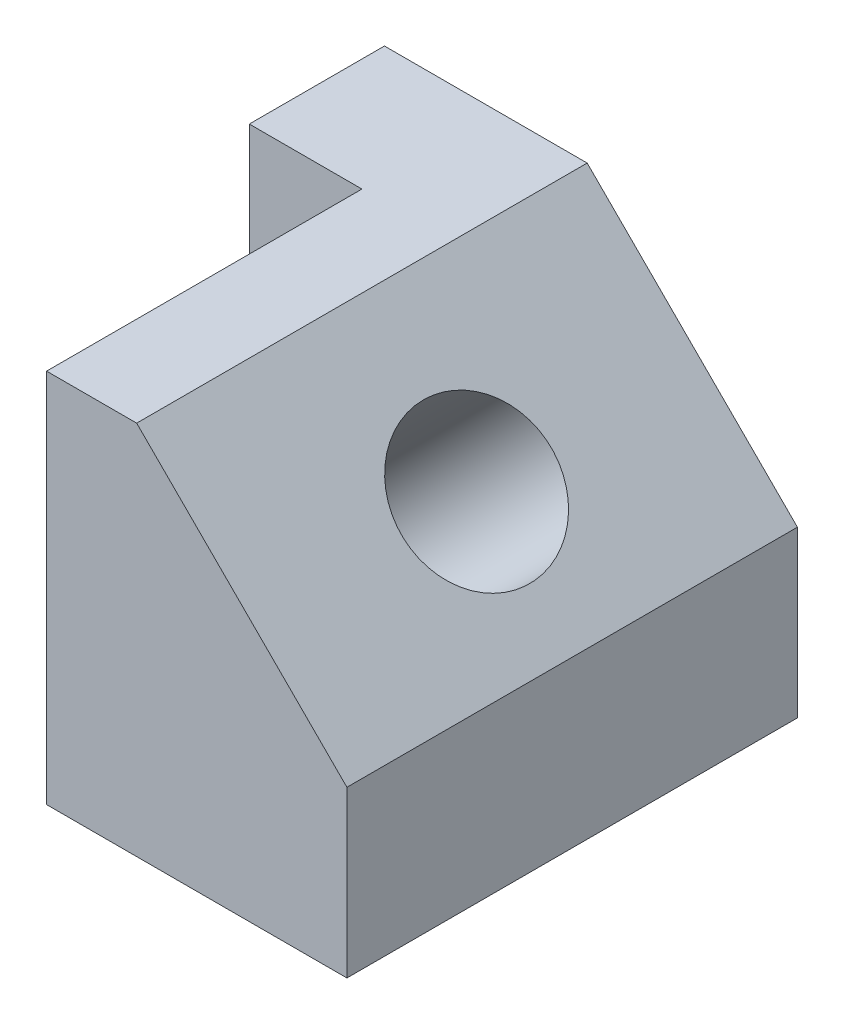
ISO-10303-21;
HEADER;
FILE_DESCRIPTION(('STEP AP214'),'2;1');
FILE_NAME('part.step','',(''),(''),'','','');
FILE_SCHEMA(('AUTOMOTIVE_DESIGN { 1 0 10303 214 1 1 1 1 }'));
ENDSEC;
DATA;
#1=APPLICATION_CONTEXT('core data for automotive mechanical design processes');
#2=APPLICATION_PROTOCOL_DEFINITION('international standard','automotive_design',2000,#1);
#3=PRODUCT_CONTEXT('',#1,'mechanical');
#4=PRODUCT('Part','Part','',(#3));
#5=PRODUCT_RELATED_PRODUCT_CATEGORY('part','',(#4));
#6=PRODUCT_DEFINITION_FORMATION('','',#4);
#7=PRODUCT_DEFINITION_CONTEXT('part definition',#1,'design');
#8=PRODUCT_DEFINITION('design','',#6,#7);
#9=PRODUCT_DEFINITION_SHAPE('','',#8);
#10=(LENGTH_UNIT() NAMED_UNIT(*) SI_UNIT(.MILLI.,.METRE.));
#11=(NAMED_UNIT(*) PLANE_ANGLE_UNIT() SI_UNIT($,.RADIAN.));
#12=(NAMED_UNIT(*) SI_UNIT($,.STERADIAN.) SOLID_ANGLE_UNIT());
#13=UNCERTAINTY_MEASURE_WITH_UNIT(LENGTH_MEASURE(1.E-05),#10,'distance_accuracy_value','');
#14=(GEOMETRIC_REPRESENTATION_CONTEXT(3) GLOBAL_UNCERTAINTY_ASSIGNED_CONTEXT((#13)) GLOBAL_UNIT_ASSIGNED_CONTEXT((#10,
#11,#12)) REPRESENTATION_CONTEXT('',''));
#15=CARTESIAN_POINT('',(0.,0.,0.));
#16=DIRECTION('',(0.,0.,1.));
#17=DIRECTION('',(1.,0.,0.));
#18=AXIS2_PLACEMENT_3D('',#15,#16,#17);
#19=CARTESIAN_POINT('',(0.,50.,18.));
#20=DIRECTION('',(0.,-1.,0.));
#21=DIRECTION('',(0.,0.,-1.));
#22=AXIS2_PLACEMENT_3D('',#19,#20,#21);
#23=PLANE('',#22);
#24=DIRECTION('',(-1.,0.,0.));
#25=VECTOR('',#24,1.);
#26=CARTESIAN_POINT('',(0.,50.,0.));
#27=LINE('',#26,#25);
#28=CARTESIAN_POINT('',(-28.0000000000001,50.,0.));
#29=VERTEX_POINT('',#28);
#30=CARTESIAN_POINT('',(-55.,50.,0.));
#31=VERTEX_POINT('',#30);
#32=EDGE_CURVE('E138',#29,#31,#27,.T.);
#33=ORIENTED_EDGE('',*,*,#32,.T.);
#34=DIRECTION('',(0.,0.,-1.));
#35=VECTOR('',#34,1.);
#36=CARTESIAN_POINT('',(-55.,50.,18.));
#37=LINE('',#36,#35);
#38=CARTESIAN_POINT('',(-55.,50.,18.));
#39=VERTEX_POINT('',#38);
#40=EDGE_CURVE('E11',#39,#31,#37,.T.);
#41=ORIENTED_EDGE('',*,*,#40,.F.);
#42=DIRECTION('',(-1.,0.,0.));
#43=VECTOR('',#42,1.);
#44=CARTESIAN_POINT('',(0.,50.,18.));
#45=LINE('',#44,#43);
#46=CARTESIAN_POINT('',(-40.,50.,18.));
#47=VERTEX_POINT('',#46);
#48=EDGE_CURVE('E59',#47,#39,#45,.T.);
#49=ORIENTED_EDGE('',*,*,#48,.F.);
#50=DIRECTION('',(0.,0.,-1.));
#51=VECTOR('',#50,1.);
#52=CARTESIAN_POINT('',(-40.,50.,60.));
#53=LINE('',#52,#51);
#54=CARTESIAN_POINT('',(-40.,50.,60.));
#55=VERTEX_POINT('',#54);
#56=EDGE_CURVE('E128',#55,#47,#53,.T.);
#57=ORIENTED_EDGE('',*,*,#56,.F.);
#58=DIRECTION('',(-1.,0.,0.));
#59=VECTOR('',#58,1.);
#60=CARTESIAN_POINT('',(0.,50.,60.));
#61=LINE('',#60,#59);
#62=CARTESIAN_POINT('',(-28.0000000000001,50.,60.));
#63=VERTEX_POINT('',#62);
#64=EDGE_CURVE('E174',#63,#55,#61,.T.);
#65=ORIENTED_EDGE('',*,*,#64,.F.);
#66=DIRECTION('',(0.,0.,-1.));
#67=VECTOR('',#66,1.);
#68=CARTESIAN_POINT('',(-28.0000000000001,50.,60.));
#69=LINE('',#68,#67);
#70=EDGE_CURVE('E135',#63,#29,#69,.T.);
#71=ORIENTED_EDGE('',*,*,#70,.T.);
#72=EDGE_LOOP('',(#33,#41,#49,#57,#65,#71));
#73=FACE_BOUND('',#72,.T.);
#74=ADVANCED_FACE('F37',(#73),#23,.F.);
#75=CARTESIAN_POINT('',(-55.,0.,18.));
#76=DIRECTION('',(1.,0.,0.));
#77=DIRECTION('',(0.,1.,0.));
#78=AXIS2_PLACEMENT_3D('',#75,#76,#77);
#79=PLANE('',#78);
#80=DIRECTION('',(0.,-1.,0.));
#81=VECTOR('',#80,1.);
#82=CARTESIAN_POINT('',(-55.,0.,0.));
#83=LINE('',#82,#81);
#84=CARTESIAN_POINT('',(-55.,0.,0.));
#85=VERTEX_POINT('',#84);
#86=EDGE_CURVE('E147',#31,#85,#83,.T.);
#87=ORIENTED_EDGE('',*,*,#86,.T.);
#88=DIRECTION('',(0.,0.,-1.));
#89=VECTOR('',#88,1.);
#90=CARTESIAN_POINT('',(-55.,0.,18.));
#91=LINE('',#90,#89);
#92=CARTESIAN_POINT('',(-55.,0.,18.));
#93=VERTEX_POINT('',#92);
#94=EDGE_CURVE('E44',#93,#85,#91,.T.);
#95=ORIENTED_EDGE('',*,*,#94,.F.);
#96=DIRECTION('',(0.,-1.,0.));
#97=VECTOR('',#96,1.);
#98=CARTESIAN_POINT('',(-55.,0.,18.));
#99=LINE('',#98,#97);
#100=EDGE_CURVE('E78',#39,#93,#99,.T.);
#101=ORIENTED_EDGE('',*,*,#100,.F.);
#102=ORIENTED_EDGE('',*,*,#40,.T.);
#103=EDGE_LOOP('',(#87,#95,#101,#102));
#104=FACE_BOUND('',#103,.T.);
#105=ADVANCED_FACE('F194',(#104),#79,.F.);
#106=CARTESIAN_POINT('',(0.,0.,18.));
#107=DIRECTION('',(0.,-1.,0.));
#108=DIRECTION('',(0.,0.,-1.));
#109=AXIS2_PLACEMENT_3D('',#106,#107,#108);
#110=PLANE('',#109);
#111=CARTESIAN_POINT('',(-47.4558441227156,0.,30.));
#112=DIRECTION('',(0.,-1.,0.));
#113=DIRECTION('',(1.,0.,0.));
#114=AXIS2_PLACEMENT_3D('',#111,#112,#113);
#115=ELLIPSE('',#114,14.1421356237309,10.);
#116=CARTESIAN_POINT('',(-40.,0.,21.5026360435201));
#117=VERTEX_POINT('',#116);
#118=CARTESIAN_POINT('',(-40.,0.,38.4973639564799));
#119=VERTEX_POINT('',#118);
#120=EDGE_CURVE('E50',#117,#119,#115,.T.);
#121=ORIENTED_EDGE('',*,*,#120,.F.);
#122=DIRECTION('',(0.,0.,-1.));
#123=VECTOR('',#122,1.);
#124=CARTESIAN_POINT('',(-40.,0.,60.));
#125=LINE('',#124,#123);
#126=CARTESIAN_POINT('',(-40.,0.,18.));
#127=VERTEX_POINT('',#126);
#128=EDGE_CURVE('E116',#117,#127,#125,.T.);
#129=ORIENTED_EDGE('',*,*,#128,.T.);
#130=DIRECTION('',(-1.,0.,0.));
#131=VECTOR('',#130,1.);
#132=CARTESIAN_POINT('',(0.,0.,18.));
#133=LINE('',#132,#131);
#134=EDGE_CURVE('E142',#127,#93,#133,.T.);
#135=ORIENTED_EDGE('',*,*,#134,.T.);
#136=ORIENTED_EDGE('',*,*,#94,.T.);
#137=DIRECTION('',(-1.,0.,0.));
#138=VECTOR('',#137,1.);
#139=CARTESIAN_POINT('',(0.,0.,0.));
#140=LINE('',#139,#138);
#141=CARTESIAN_POINT('',(0.,0.,0.));
#142=VERTEX_POINT('',#141);
#143=EDGE_CURVE('E140',#142,#85,#140,.T.);
#144=ORIENTED_EDGE('',*,*,#143,.F.);
#145=DIRECTION('',(0.,0.,-1.));
#146=VECTOR('',#145,1.);
#147=CARTESIAN_POINT('',(0.,0.,60.));
#148=LINE('',#147,#146);
#149=CARTESIAN_POINT('',(0.,0.,60.));
#150=VERTEX_POINT('',#149);
#151=EDGE_CURVE('E126',#150,#142,#148,.T.);
#152=ORIENTED_EDGE('',*,*,#151,.F.);
#153=DIRECTION('',(1.,0.,0.));
#154=VECTOR('',#153,1.);
#155=CARTESIAN_POINT('',(0.,0.,60.));
#156=LINE('',#155,#154);
#157=CARTESIAN_POINT('',(-40.,0.,60.));
#158=VERTEX_POINT('',#157);
#159=EDGE_CURVE('E165',#158,#150,#156,.T.);
#160=ORIENTED_EDGE('',*,*,#159,.F.);
#161=EDGE_CURVE('E119',#158,#119,#125,.T.);
#162=ORIENTED_EDGE('',*,*,#161,.T.);
#163=EDGE_LOOP('',(#121,#129,#135,#136,#144,#152,#160,#162));
#164=FACE_BOUND('',#163,.T.);
#165=ADVANCED_FACE('F115',(#164),#110,.T.);
#166=CARTESIAN_POINT('',(0.,0.,18.));
#167=DIRECTION('',(0.,0.,1.));
#168=DIRECTION('',(1.,0.,0.));
#169=AXIS2_PLACEMENT_3D('',#166,#167,#168);
#170=PLANE('',#169);
#171=ORIENTED_EDGE('',*,*,#48,.T.);
#172=ORIENTED_EDGE('',*,*,#100,.T.);
#173=ORIENTED_EDGE('',*,*,#134,.F.);
#174=DIRECTION('',(0.,-1.,0.));
#175=VECTOR('',#174,1.);
#176=CARTESIAN_POINT('',(-40.,0.,18.));
#177=LINE('',#176,#175);
#178=EDGE_CURVE('E125',#47,#127,#177,.T.);
#179=ORIENTED_EDGE('',*,*,#178,.F.);
#180=EDGE_LOOP('',(#171,#172,#173,#179));
#181=FACE_BOUND('',#180,.T.);
#182=ADVANCED_FACE('F201',(#181),#170,.T.);
#183=CARTESIAN_POINT('',(0.,0.,0.));
#184=DIRECTION('',(0.,0.,1.));
#185=DIRECTION('',(1.,0.,0.));
#186=AXIS2_PLACEMENT_3D('',#183,#184,#185);
#187=PLANE('',#186);
#188=ORIENTED_EDGE('',*,*,#32,.F.);
#189=DIRECTION('',(-0.707106781186549,0.707106781186546,0.));
#190=VECTOR('',#189,1.);
#191=CARTESIAN_POINT('',(11.,11.,0.));
#192=LINE('',#191,#190);
#193=CARTESIAN_POINT('',(0.,22.,0.));
#194=VERTEX_POINT('',#193);
#195=EDGE_CURVE('E120',#194,#29,#192,.T.);
#196=ORIENTED_EDGE('',*,*,#195,.F.);
#197=DIRECTION('',(0.,1.,0.));
#198=VECTOR('',#197,1.);
#199=CARTESIAN_POINT('',(0.,0.,0.));
#200=LINE('',#199,#198);
#201=EDGE_CURVE('E154',#142,#194,#200,.T.);
#202=ORIENTED_EDGE('',*,*,#201,.F.);
#203=ORIENTED_EDGE('',*,*,#143,.T.);
#204=ORIENTED_EDGE('',*,*,#86,.F.);
#205=EDGE_LOOP('',(#188,#196,#202,#203,#204));
#206=FACE_BOUND('',#205,.T.);
#207=ADVANCED_FACE('F152',(#206),#187,.F.);
#208=CARTESIAN_POINT('',(-40.,0.,60.));
#209=DIRECTION('',(1.,0.,0.));
#210=DIRECTION('',(0.,1.,0.));
#211=AXIS2_PLACEMENT_3D('',#208,#209,#210);
#212=PLANE('',#211);
#213=ORIENTED_EDGE('',*,*,#128,.F.);
#214=CARTESIAN_POINT('',(-40.,7.45584412271561,30.));
#215=DIRECTION('',(1.,0.,0.));
#216=DIRECTION('',(0.,1.,0.));
#217=AXIS2_PLACEMENT_3D('',#214,#215,#216);
#218=ELLIPSE('',#217,14.142135623731,10.);
#219=EDGE_CURVE('E106',#117,#119,#218,.T.);
#220=ORIENTED_EDGE('',*,*,#219,.T.);
#221=ORIENTED_EDGE('',*,*,#161,.F.);
#222=DIRECTION('',(0.,-1.,0.));
#223=VECTOR('',#222,1.);
#224=CARTESIAN_POINT('',(-40.,0.,60.));
#225=LINE('',#224,#223);
#226=EDGE_CURVE('E167',#55,#158,#225,.T.);
#227=ORIENTED_EDGE('',*,*,#226,.F.);
#228=ORIENTED_EDGE('',*,*,#56,.T.);
#229=ORIENTED_EDGE('',*,*,#178,.T.);
#230=EDGE_LOOP('',(#213,#220,#221,#227,#228,#229));
#231=FACE_BOUND('',#230,.T.);
#232=ADVANCED_FACE('F123',(#231),#212,.F.);
#233=CARTESIAN_POINT('',(11.,11.,60.));
#234=DIRECTION('',(-0.707106781186546,-0.707106781186549,0.));
#235=DIRECTION('',(0.707106781186549,-0.707106781186546,0.));
#236=AXIS2_PLACEMENT_3D('',#233,#234,#235);
#237=PLANE('',#236);
#238=CARTESIAN_POINT('',(-12.7279220613579,34.7279220613578,30.));
#239=DIRECTION('',(0.707106781186546,0.707106781186549,0.));
#240=DIRECTION('',(-0.707106781186549,0.707106781186546,0.));
#241=AXIS2_PLACEMENT_3D('',#238,#239,#240);
#242=CIRCLE('',#241,10.);
#243=CARTESIAN_POINT('',(-19.7989898732234,41.7989898732233,30.));
#244=VERTEX_POINT('',#243);
#245=EDGE_CURVE('E113',#244,#244,#242,.T.);
#246=ORIENTED_EDGE('',*,*,#245,.F.);
#247=EDGE_LOOP('',(#246));
#248=FACE_BOUND('',#247,.T.);
#249=ORIENTED_EDGE('',*,*,#195,.T.);
#250=ORIENTED_EDGE('',*,*,#70,.F.);
#251=DIRECTION('',(-0.707106781186549,0.707106781186546,0.));
#252=VECTOR('',#251,1.);
#253=CARTESIAN_POINT('',(11.,11.,60.));
#254=LINE('',#253,#252);
#255=CARTESIAN_POINT('',(0.,22.,60.));
#256=VERTEX_POINT('',#255);
#257=EDGE_CURVE('E173',#256,#63,#254,.T.);
#258=ORIENTED_EDGE('',*,*,#257,.F.);
#259=DIRECTION('',(0.,0.,-1.));
#260=VECTOR('',#259,1.);
#261=CARTESIAN_POINT('',(0.,22.,60.));
#262=LINE('',#261,#260);
#263=EDGE_CURVE('E130',#256,#194,#262,.T.);
#264=ORIENTED_EDGE('',*,*,#263,.T.);
#265=EDGE_LOOP('',(#249,#250,#258,#264));
#266=FACE_BOUND('',#265,.T.);
#267=ADVANCED_FACE('F181',(#248,#266),#237,.F.);
#268=CARTESIAN_POINT('',(0.,0.,60.));
#269=DIRECTION('',(-1.,0.,0.));
#270=DIRECTION('',(0.,0.,1.));
#271=AXIS2_PLACEMENT_3D('',#268,#269,#270);
#272=PLANE('',#271);
#273=ORIENTED_EDGE('',*,*,#201,.T.);
#274=ORIENTED_EDGE('',*,*,#263,.F.);
#275=DIRECTION('',(0.,1.,0.));
#276=VECTOR('',#275,1.);
#277=CARTESIAN_POINT('',(0.,0.,60.));
#278=LINE('',#277,#276);
#279=EDGE_CURVE('E161',#150,#256,#278,.T.);
#280=ORIENTED_EDGE('',*,*,#279,.F.);
#281=ORIENTED_EDGE('',*,*,#151,.T.);
#282=EDGE_LOOP('',(#273,#274,#280,#281));
#283=FACE_BOUND('',#282,.T.);
#284=ADVANCED_FACE('F158',(#283),#272,.F.);
#285=CARTESIAN_POINT('',(0.,0.,60.));
#286=DIRECTION('',(0.,0.,1.));
#287=DIRECTION('',(1.,0.,0.));
#288=AXIS2_PLACEMENT_3D('',#285,#286,#287);
#289=PLANE('',#288);
#290=ORIENTED_EDGE('',*,*,#257,.T.);
#291=ORIENTED_EDGE('',*,*,#64,.T.);
#292=ORIENTED_EDGE('',*,*,#226,.T.);
#293=ORIENTED_EDGE('',*,*,#159,.T.);
#294=ORIENTED_EDGE('',*,*,#279,.T.);
#295=EDGE_LOOP('',(#290,#291,#292,#293,#294));
#296=FACE_BOUND('',#295,.T.);
#297=ADVANCED_FACE('F179',(#296),#289,.T.);
#298=CARTESIAN_POINT('',(-55.1543289325506,-7.69848480983509,30.));
#299=DIRECTION('',(0.707106781186546,0.707106781186549,0.));
#300=DIRECTION('',(-0.707106781186549,0.707106781186546,0.));
#301=AXIS2_PLACEMENT_3D('',#298,#299,#300);
#302=CYLINDRICAL_SURFACE('',#301,10.);
#303=ORIENTED_EDGE('',*,*,#120,.T.);
#304=ORIENTED_EDGE('',*,*,#219,.F.);
#305=EDGE_LOOP('',(#303,#304));
#306=FACE_BOUND('',#305,.T.);
#307=ORIENTED_EDGE('',*,*,#245,.T.);
#308=EDGE_LOOP('',(#307));
#309=FACE_BOUND('',#308,.T.);
#310=ADVANCED_FACE('F107',(#306,#309),#302,.F.);
#311=CLOSED_SHELL('',(#74,#105,#165,#182,#207,#232,#267,#284,#297,#310));
#312=MANIFOLD_SOLID_BREP('B2',#311);
#313=ADVANCED_BREP_SHAPE_REPRESENTATION('',(#18,#312),#14);
#314=SHAPE_DEFINITION_REPRESENTATION(#9,#313);
ENDSEC;
END-ISO-10303-21;
